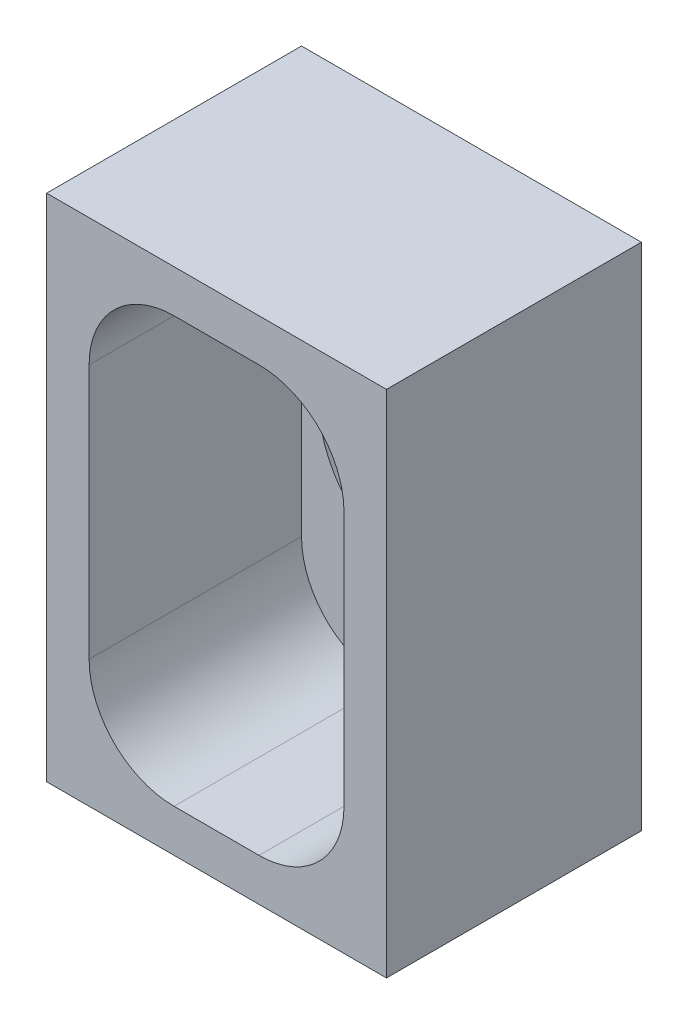
ISO-10303-21;
HEADER;
FILE_DESCRIPTION(('STEP AP214'),'2;1');
FILE_NAME('part.step','',(''),(''),'','','');
FILE_SCHEMA(('AUTOMOTIVE_DESIGN { 1 0 10303 214 1 1 1 1 }'));
ENDSEC;
DATA;
#1=APPLICATION_CONTEXT('core data for automotive mechanical design processes');
#2=APPLICATION_PROTOCOL_DEFINITION('international standard','automotive_design',2000,#1);
#3=PRODUCT_CONTEXT('',#1,'mechanical');
#4=PRODUCT('Part','Part','',(#3));
#5=PRODUCT_RELATED_PRODUCT_CATEGORY('part','',(#4));
#6=PRODUCT_DEFINITION_FORMATION('','',#4);
#7=PRODUCT_DEFINITION_CONTEXT('part definition',#1,'design');
#8=PRODUCT_DEFINITION('design','',#6,#7);
#9=PRODUCT_DEFINITION_SHAPE('','',#8);
#10=(LENGTH_UNIT() NAMED_UNIT(*) SI_UNIT(.MILLI.,.METRE.));
#11=(NAMED_UNIT(*) PLANE_ANGLE_UNIT() SI_UNIT($,.RADIAN.));
#12=(NAMED_UNIT(*) SI_UNIT($,.STERADIAN.) SOLID_ANGLE_UNIT());
#13=UNCERTAINTY_MEASURE_WITH_UNIT(LENGTH_MEASURE(1.E-05),#10,'distance_accuracy_value','');
#14=(GEOMETRIC_REPRESENTATION_CONTEXT(3) GLOBAL_UNCERTAINTY_ASSIGNED_CONTEXT((#13)) GLOBAL_UNIT_ASSIGNED_CONTEXT((#10,
#11,#12)) REPRESENTATION_CONTEXT('',''));
#15=CARTESIAN_POINT('',(0.,0.,0.));
#16=DIRECTION('',(0.,0.,1.));
#17=DIRECTION('',(1.,0.,0.));
#18=AXIS2_PLACEMENT_3D('',#15,#16,#17);
#19=CARTESIAN_POINT('',(0.,8.5,5.));
#20=DIRECTION('',(0.,0.,-1.));
#21=DIRECTION('',(-1.,0.,0.));
#22=AXIS2_PLACEMENT_3D('',#19,#20,#21);
#23=CYLINDRICAL_SURFACE('',#22,1.6);
#24=CARTESIAN_POINT('',(0.,8.5,0.));
#25=DIRECTION('',(0.,0.,1.));
#26=DIRECTION('',(1.,0.,0.));
#27=AXIS2_PLACEMENT_3D('',#24,#25,#26);
#28=CIRCLE('',#27,1.6);
#29=CARTESIAN_POINT('',(1.6,8.5,0.));
#30=VERTEX_POINT('',#29);
#31=EDGE_CURVE('E199',#30,#30,#28,.T.);
#32=ORIENTED_EDGE('',*,*,#31,.F.);
#33=EDGE_LOOP('',(#32));
#34=FACE_BOUND('',#33,.T.);
#35=CARTESIAN_POINT('',(0.,8.5,2.5));
#36=DIRECTION('',(0.,0.,1.));
#37=DIRECTION('',(1.,0.,0.));
#38=AXIS2_PLACEMENT_3D('',#35,#36,#37);
#39=CIRCLE('',#38,1.6);
#40=CARTESIAN_POINT('',(1.6,8.5,2.5));
#41=VERTEX_POINT('',#40);
#42=EDGE_CURVE('E184',#41,#41,#39,.T.);
#43=ORIENTED_EDGE('',*,*,#42,.T.);
#44=EDGE_LOOP('',(#43));
#45=FACE_BOUND('',#44,.T.);
#46=ADVANCED_FACE('F33',(#34,#45),#23,.F.);
#47=CARTESIAN_POINT('',(0.,0.,5.));
#48=DIRECTION('',(0.,0.,-1.));
#49=DIRECTION('',(-1.,0.,0.));
#50=AXIS2_PLACEMENT_3D('',#47,#48,#49);
#51=CYLINDRICAL_SURFACE('',#50,3.25);
#52=CARTESIAN_POINT('',(0.,0.,0.));
#53=DIRECTION('',(0.,0.,1.));
#54=DIRECTION('',(1.,0.,0.));
#55=AXIS2_PLACEMENT_3D('',#52,#53,#54);
#56=CIRCLE('',#55,3.25);
#57=CARTESIAN_POINT('',(3.25,0.,0.));
#58=VERTEX_POINT('',#57);
#59=EDGE_CURVE('E196',#58,#58,#56,.T.);
#60=ORIENTED_EDGE('',*,*,#59,.F.);
#61=EDGE_LOOP('',(#60));
#62=FACE_BOUND('',#61,.T.);
#63=CARTESIAN_POINT('',(0.,0.,2.5));
#64=DIRECTION('',(0.,0.,1.));
#65=DIRECTION('',(1.,0.,0.));
#66=AXIS2_PLACEMENT_3D('',#63,#64,#65);
#67=CIRCLE('',#66,3.25);
#68=CARTESIAN_POINT('',(3.25,0.,2.5));
#69=VERTEX_POINT('',#68);
#70=EDGE_CURVE('E181',#69,#69,#67,.T.);
#71=ORIENTED_EDGE('',*,*,#70,.T.);
#72=EDGE_LOOP('',(#71));
#73=FACE_BOUND('',#72,.T.);
#74=ADVANCED_FACE('F294',(#62,#73),#51,.F.);
#75=CARTESIAN_POINT('',(8.5,0.,5.));
#76=DIRECTION('',(0.,0.,-1.));
#77=DIRECTION('',(-1.,0.,0.));
#78=AXIS2_PLACEMENT_3D('',#75,#76,#77);
#79=CYLINDRICAL_SURFACE('',#78,1.6);
#80=CARTESIAN_POINT('',(8.5,0.,0.));
#81=DIRECTION('',(0.,0.,1.));
#82=DIRECTION('',(1.,0.,0.));
#83=AXIS2_PLACEMENT_3D('',#80,#81,#82);
#84=CIRCLE('',#83,1.6);
#85=CARTESIAN_POINT('',(10.1,0.,0.));
#86=VERTEX_POINT('',#85);
#87=EDGE_CURVE('E193',#86,#86,#84,.T.);
#88=ORIENTED_EDGE('',*,*,#87,.F.);
#89=EDGE_LOOP('',(#88));
#90=FACE_BOUND('',#89,.T.);
#91=CARTESIAN_POINT('',(8.5,0.,2.5));
#92=DIRECTION('',(0.,0.,1.));
#93=DIRECTION('',(1.,0.,0.));
#94=AXIS2_PLACEMENT_3D('',#91,#92,#93);
#95=CIRCLE('',#94,1.6);
#96=CARTESIAN_POINT('',(10.1,0.,2.5));
#97=VERTEX_POINT('',#96);
#98=EDGE_CURVE('E178',#97,#97,#95,.T.);
#99=ORIENTED_EDGE('',*,*,#98,.T.);
#100=EDGE_LOOP('',(#99));
#101=FACE_BOUND('',#100,.T.);
#102=ADVANCED_FACE('F300',(#90,#101),#79,.F.);
#103=CARTESIAN_POINT('',(0.,-8.5,5.));
#104=DIRECTION('',(0.,0.,-1.));
#105=DIRECTION('',(-1.,0.,0.));
#106=AXIS2_PLACEMENT_3D('',#103,#104,#105);
#107=CYLINDRICAL_SURFACE('',#106,1.6);
#108=CARTESIAN_POINT('',(0.,-8.5,0.));
#109=DIRECTION('',(0.,0.,1.));
#110=DIRECTION('',(1.,0.,0.));
#111=AXIS2_PLACEMENT_3D('',#108,#109,#110);
#112=CIRCLE('',#111,1.6);
#113=CARTESIAN_POINT('',(1.6,-8.5,0.));
#114=VERTEX_POINT('',#113);
#115=EDGE_CURVE('E190',#114,#114,#112,.T.);
#116=ORIENTED_EDGE('',*,*,#115,.F.);
#117=EDGE_LOOP('',(#116));
#118=FACE_BOUND('',#117,.T.);
#119=CARTESIAN_POINT('',(0.,-8.5,2.5));
#120=DIRECTION('',(0.,0.,1.));
#121=DIRECTION('',(1.,0.,0.));
#122=AXIS2_PLACEMENT_3D('',#119,#120,#121);
#123=CIRCLE('',#122,1.6);
#124=CARTESIAN_POINT('',(1.6,-8.5,2.5));
#125=VERTEX_POINT('',#124);
#126=EDGE_CURVE('E175',#125,#125,#123,.T.);
#127=ORIENTED_EDGE('',*,*,#126,.T.);
#128=EDGE_LOOP('',(#127));
#129=FACE_BOUND('',#128,.T.);
#130=ADVANCED_FACE('F430',(#118,#129),#107,.F.);
#131=CARTESIAN_POINT('',(-8.5,0.,5.));
#132=DIRECTION('',(0.,0.,-1.));
#133=DIRECTION('',(-1.,0.,0.));
#134=AXIS2_PLACEMENT_3D('',#131,#132,#133);
#135=CYLINDRICAL_SURFACE('',#134,1.6);
#136=CARTESIAN_POINT('',(-8.5,0.,0.));
#137=DIRECTION('',(0.,0.,1.));
#138=DIRECTION('',(1.,0.,0.));
#139=AXIS2_PLACEMENT_3D('',#136,#137,#138);
#140=CIRCLE('',#139,1.6);
#141=CARTESIAN_POINT('',(-6.9,0.,0.));
#142=VERTEX_POINT('',#141);
#143=EDGE_CURVE('E187',#142,#142,#140,.T.);
#144=ORIENTED_EDGE('',*,*,#143,.F.);
#145=EDGE_LOOP('',(#144));
#146=FACE_BOUND('',#145,.T.);
#147=CARTESIAN_POINT('',(-8.5,0.,2.5));
#148=DIRECTION('',(0.,0.,1.));
#149=DIRECTION('',(1.,0.,0.));
#150=AXIS2_PLACEMENT_3D('',#147,#148,#149);
#151=CIRCLE('',#150,1.6);
#152=CARTESIAN_POINT('',(-6.9,0.,2.5));
#153=VERTEX_POINT('',#152);
#154=EDGE_CURVE('E172',#153,#153,#151,.T.);
#155=ORIENTED_EDGE('',*,*,#154,.T.);
#156=EDGE_LOOP('',(#155));
#157=FACE_BOUND('',#156,.T.);
#158=ADVANCED_FACE('F310',(#146,#157),#135,.F.);
#159=CARTESIAN_POINT('',(0.,0.,5.));
#160=DIRECTION('',(0.,0.,1.));
#161=DIRECTION('',(1.,0.,0.));
#162=AXIS2_PLACEMENT_3D('',#159,#160,#161);
#163=PLANE('',#162);
#164=DIRECTION('',(0.,1.,0.));
#165=VECTOR('',#164,1.);
#166=CARTESIAN_POINT('',(-15.,25.,5.));
#167=LINE('',#166,#165);
#168=CARTESIAN_POINT('',(-15.,-15.,5.));
#169=VERTEX_POINT('',#168);
#170=CARTESIAN_POINT('',(-15.,15.,5.));
#171=VERTEX_POINT('',#170);
#172=EDGE_CURVE('E267',#169,#171,#167,.T.);
#173=ORIENTED_EDGE('',*,*,#172,.F.);
#174=CARTESIAN_POINT('',(-5.00000000000001,-15.,5.));
#175=DIRECTION('',(0.,0.,1.));
#176=DIRECTION('',(1.,0.,0.));
#177=AXIS2_PLACEMENT_3D('',#174,#175,#176);
#178=CIRCLE('',#177,10.);
#179=CARTESIAN_POINT('',(-5.00000000000001,-25.,5.));
#180=VERTEX_POINT('',#179);
#181=EDGE_CURVE('E226',#169,#180,#178,.T.);
#182=ORIENTED_EDGE('',*,*,#181,.T.);
#183=DIRECTION('',(1.,0.,0.));
#184=VECTOR('',#183,1.);
#185=CARTESIAN_POINT('',(-20.,-25.,5.));
#186=LINE('',#185,#184);
#187=CARTESIAN_POINT('',(5.00000000000001,-25.,5.));
#188=VERTEX_POINT('',#187);
#189=EDGE_CURVE('E206',#180,#188,#186,.T.);
#190=ORIENTED_EDGE('',*,*,#189,.T.);
#191=CARTESIAN_POINT('',(5.00000000000001,-15.,5.));
#192=DIRECTION('',(0.,0.,1.));
#193=DIRECTION('',(1.,0.,0.));
#194=AXIS2_PLACEMENT_3D('',#191,#192,#193);
#195=CIRCLE('',#194,10.);
#196=CARTESIAN_POINT('',(15.,-15.,5.));
#197=VERTEX_POINT('',#196);
#198=EDGE_CURVE('E224',#188,#197,#195,.T.);
#199=ORIENTED_EDGE('',*,*,#198,.T.);
#200=DIRECTION('',(0.,1.,0.));
#201=VECTOR('',#200,1.);
#202=CARTESIAN_POINT('',(15.,25.,5.));
#203=LINE('',#202,#201);
#204=CARTESIAN_POINT('',(15.,15.,5.));
#205=VERTEX_POINT('',#204);
#206=EDGE_CURVE('E252',#197,#205,#203,.T.);
#207=ORIENTED_EDGE('',*,*,#206,.T.);
#208=CARTESIAN_POINT('',(5.,15.,5.));
#209=DIRECTION('',(0.,0.,1.));
#210=DIRECTION('',(1.,0.,0.));
#211=AXIS2_PLACEMENT_3D('',#208,#209,#210);
#212=CIRCLE('',#211,10.);
#213=CARTESIAN_POINT('',(5.,25.,5.));
#214=VERTEX_POINT('',#213);
#215=EDGE_CURVE('E222',#205,#214,#212,.T.);
#216=ORIENTED_EDGE('',*,*,#215,.T.);
#217=DIRECTION('',(-1.,0.,0.));
#218=VECTOR('',#217,1.);
#219=CARTESIAN_POINT('',(-20.,25.,5.));
#220=LINE('',#219,#218);
#221=CARTESIAN_POINT('',(-5.,25.,5.));
#222=VERTEX_POINT('',#221);
#223=EDGE_CURVE('E203',#214,#222,#220,.T.);
#224=ORIENTED_EDGE('',*,*,#223,.T.);
#225=CARTESIAN_POINT('',(-5.,15.,5.));
#226=DIRECTION('',(0.,0.,1.));
#227=DIRECTION('',(1.,0.,0.));
#228=AXIS2_PLACEMENT_3D('',#225,#226,#227);
#229=CIRCLE('',#228,10.);
#230=EDGE_CURVE('E220',#222,#171,#229,.T.);
#231=ORIENTED_EDGE('',*,*,#230,.T.);
#232=EDGE_LOOP('',(#173,#182,#190,#199,#207,#216,#224,#231));
#233=FACE_BOUND('',#232,.T.);
#234=CARTESIAN_POINT('',(0.,0.,5.));
#235=DIRECTION('',(0.,0.,1.));
#236=DIRECTION('',(1.,0.,0.));
#237=AXIS2_PLACEMENT_3D('',#234,#235,#236);
#238=CIRCLE('',#237,13.);
#239=CARTESIAN_POINT('',(13.,0.,5.));
#240=VERTEX_POINT('',#239);
#241=EDGE_CURVE('E166',#240,#240,#238,.T.);
#242=ORIENTED_EDGE('',*,*,#241,.F.);
#243=EDGE_LOOP('',(#242));
#244=FACE_BOUND('',#243,.T.);
#245=ADVANCED_FACE('F258',(#233,#244),#163,.T.);
#246=CARTESIAN_POINT('',(0.,0.,0.));
#247=DIRECTION('',(0.,0.,1.));
#248=DIRECTION('',(1.,0.,0.));
#249=AXIS2_PLACEMENT_3D('',#246,#247,#248);
#250=PLANE('',#249);
#251=DIRECTION('',(0.,1.,0.));
#252=VECTOR('',#251,1.);
#253=CARTESIAN_POINT('',(20.,25.,0.));
#254=LINE('',#253,#252);
#255=CARTESIAN_POINT('',(20.,-30.,0.));
#256=VERTEX_POINT('',#255);
#257=CARTESIAN_POINT('',(20.,30.,0.));
#258=VERTEX_POINT('',#257);
#259=EDGE_CURVE('E202',#256,#258,#254,.T.);
#260=ORIENTED_EDGE('',*,*,#259,.F.);
#261=DIRECTION('',(-1.,0.,0.));
#262=VECTOR('',#261,1.);
#263=CARTESIAN_POINT('',(20.,-30.,0.));
#264=LINE('',#263,#262);
#265=CARTESIAN_POINT('',(-20.,-30.,0.));
#266=VERTEX_POINT('',#265);
#267=EDGE_CURVE('E141',#256,#266,#264,.T.);
#268=ORIENTED_EDGE('',*,*,#267,.T.);
#269=DIRECTION('',(0.,-1.,0.));
#270=VECTOR('',#269,1.);
#271=CARTESIAN_POINT('',(-20.,25.,0.));
#272=LINE('',#271,#270);
#273=CARTESIAN_POINT('',(-20.,30.,0.));
#274=VERTEX_POINT('',#273);
#275=EDGE_CURVE('E207',#274,#266,#272,.T.);
#276=ORIENTED_EDGE('',*,*,#275,.F.);
#277=DIRECTION('',(1.,0.,0.));
#278=VECTOR('',#277,1.);
#279=CARTESIAN_POINT('',(20.,30.,0.));
#280=LINE('',#279,#278);
#281=EDGE_CURVE('E133',#274,#258,#280,.T.);
#282=ORIENTED_EDGE('',*,*,#281,.T.);
#283=EDGE_LOOP('',(#260,#268,#276,#282));
#284=FACE_BOUND('',#283,.T.);
#285=ORIENTED_EDGE('',*,*,#31,.T.);
#286=EDGE_LOOP('',(#285));
#287=FACE_BOUND('',#286,.T.);
#288=ORIENTED_EDGE('',*,*,#59,.T.);
#289=EDGE_LOOP('',(#288));
#290=FACE_BOUND('',#289,.T.);
#291=ORIENTED_EDGE('',*,*,#87,.T.);
#292=EDGE_LOOP('',(#291));
#293=FACE_BOUND('',#292,.T.);
#294=ORIENTED_EDGE('',*,*,#115,.T.);
#295=EDGE_LOOP('',(#294));
#296=FACE_BOUND('',#295,.T.);
#297=ORIENTED_EDGE('',*,*,#143,.T.);
#298=EDGE_LOOP('',(#297));
#299=FACE_BOUND('',#298,.T.);
#300=ADVANCED_FACE('F309',(#284,#287,#290,#293,#296,#299),#250,.F.);
#301=CARTESIAN_POINT('',(20.,25.,5.));
#302=DIRECTION('',(-1.,0.,0.));
#303=DIRECTION('',(0.,-1.,0.));
#304=AXIS2_PLACEMENT_3D('',#301,#302,#303);
#305=PLANE('',#304);
#306=ORIENTED_EDGE('',*,*,#259,.T.);
#307=DIRECTION('',(0.,0.,-1.));
#308=VECTOR('',#307,1.);
#309=CARTESIAN_POINT('',(20.,30.,30.));
#310=LINE('',#309,#308);
#311=CARTESIAN_POINT('',(20.,30.,30.));
#312=VERTEX_POINT('',#311);
#313=EDGE_CURVE('E127',#312,#258,#310,.T.);
#314=ORIENTED_EDGE('',*,*,#313,.F.);
#315=DIRECTION('',(0.,-1.,0.));
#316=VECTOR('',#315,1.);
#317=CARTESIAN_POINT('',(20.,25.,30.));
#318=LINE('',#317,#316);
#319=CARTESIAN_POINT('',(20.,-30.,30.));
#320=VERTEX_POINT('',#319);
#321=EDGE_CURVE('E121',#312,#320,#318,.T.);
#322=ORIENTED_EDGE('',*,*,#321,.T.);
#323=DIRECTION('',(0.,0.,-1.));
#324=VECTOR('',#323,1.);
#325=CARTESIAN_POINT('',(20.,-30.,30.));
#326=LINE('',#325,#324);
#327=EDGE_CURVE('E124',#320,#256,#326,.T.);
#328=ORIENTED_EDGE('',*,*,#327,.T.);
#329=EDGE_LOOP('',(#306,#314,#322,#328));
#330=FACE_BOUND('',#329,.T.);
#331=ADVANCED_FACE('F123',(#330),#305,.F.);
#332=CARTESIAN_POINT('',(-20.,25.,5.));
#333=DIRECTION('',(1.,0.,0.));
#334=DIRECTION('',(0.,1.,0.));
#335=AXIS2_PLACEMENT_3D('',#332,#333,#334);
#336=PLANE('',#335);
#337=ORIENTED_EDGE('',*,*,#275,.T.);
#338=DIRECTION('',(0.,0.,-1.));
#339=VECTOR('',#338,1.);
#340=CARTESIAN_POINT('',(-20.,-30.,30.));
#341=LINE('',#340,#339);
#342=CARTESIAN_POINT('',(-20.,-30.,30.));
#343=VERTEX_POINT('',#342);
#344=EDGE_CURVE('E142',#343,#266,#341,.T.);
#345=ORIENTED_EDGE('',*,*,#344,.F.);
#346=DIRECTION('',(0.,1.,0.));
#347=VECTOR('',#346,1.);
#348=CARTESIAN_POINT('',(-20.,25.,30.));
#349=LINE('',#348,#347);
#350=CARTESIAN_POINT('',(-20.,30.,30.));
#351=VERTEX_POINT('',#350);
#352=EDGE_CURVE('E147',#343,#351,#349,.T.);
#353=ORIENTED_EDGE('',*,*,#352,.T.);
#354=DIRECTION('',(0.,0.,-1.));
#355=VECTOR('',#354,1.);
#356=CARTESIAN_POINT('',(-20.,30.,30.));
#357=LINE('',#356,#355);
#358=EDGE_CURVE('E162',#351,#274,#357,.T.);
#359=ORIENTED_EDGE('',*,*,#358,.T.);
#360=EDGE_LOOP('',(#337,#345,#353,#359));
#361=FACE_BOUND('',#360,.T.);
#362=ADVANCED_FACE('F314',(#361),#336,.F.);
#363=CARTESIAN_POINT('',(0.,0.,2.5));
#364=DIRECTION('',(0.,0.,1.));
#365=DIRECTION('',(1.,0.,0.));
#366=AXIS2_PLACEMENT_3D('',#363,#364,#365);
#367=CYLINDRICAL_SURFACE('',#366,13.);
#368=CARTESIAN_POINT('',(0.,0.,2.5));
#369=DIRECTION('',(0.,0.,1.));
#370=DIRECTION('',(1.,0.,0.));
#371=AXIS2_PLACEMENT_3D('',#368,#369,#370);
#372=CIRCLE('',#371,13.);
#373=CARTESIAN_POINT('',(13.,0.,2.5));
#374=VERTEX_POINT('',#373);
#375=EDGE_CURVE('E169',#374,#374,#372,.T.);
#376=ORIENTED_EDGE('',*,*,#375,.F.);
#377=EDGE_LOOP('',(#376));
#378=FACE_BOUND('',#377,.T.);
#379=ORIENTED_EDGE('',*,*,#241,.T.);
#380=EDGE_LOOP('',(#379));
#381=FACE_BOUND('',#380,.T.);
#382=ADVANCED_FACE('F317',(#378,#381),#367,.F.);
#383=CARTESIAN_POINT('',(0.,0.,2.5));
#384=DIRECTION('',(0.,0.,1.));
#385=DIRECTION('',(1.,0.,0.));
#386=AXIS2_PLACEMENT_3D('',#383,#384,#385);
#387=PLANE('',#386);
#388=ORIENTED_EDGE('',*,*,#42,.F.);
#389=EDGE_LOOP('',(#388));
#390=FACE_BOUND('',#389,.T.);
#391=ORIENTED_EDGE('',*,*,#70,.F.);
#392=EDGE_LOOP('',(#391));
#393=FACE_BOUND('',#392,.T.);
#394=ORIENTED_EDGE('',*,*,#98,.F.);
#395=EDGE_LOOP('',(#394));
#396=FACE_BOUND('',#395,.T.);
#397=ORIENTED_EDGE('',*,*,#126,.F.);
#398=EDGE_LOOP('',(#397));
#399=FACE_BOUND('',#398,.T.);
#400=ORIENTED_EDGE('',*,*,#154,.F.);
#401=EDGE_LOOP('',(#400));
#402=FACE_BOUND('',#401,.T.);
#403=ORIENTED_EDGE('',*,*,#375,.T.);
#404=EDGE_LOOP('',(#403));
#405=FACE_BOUND('',#404,.T.);
#406=ADVANCED_FACE('F336',(#390,#393,#396,#399,#402,#405),#387,.T.);
#407=CARTESIAN_POINT('',(20.,25.,30.));
#408=DIRECTION('',(0.,-1.,0.));
#409=DIRECTION('',(0.,0.,-1.));
#410=AXIS2_PLACEMENT_3D('',#407,#408,#409);
#411=PLANE('',#410);
#412=ORIENTED_EDGE('',*,*,#223,.F.);
#413=DIRECTION('',(0.,0.,1.));
#414=VECTOR('',#413,1.);
#415=CARTESIAN_POINT('',(5.,25.,30.));
#416=LINE('',#415,#414);
#417=CARTESIAN_POINT('',(5.,25.,30.));
#418=VERTEX_POINT('',#417);
#419=EDGE_CURVE('E239',#214,#418,#416,.T.);
#420=ORIENTED_EDGE('',*,*,#419,.T.);
#421=DIRECTION('',(-1.,0.,0.));
#422=VECTOR('',#421,1.);
#423=CARTESIAN_POINT('',(20.,25.,30.));
#424=LINE('',#423,#422);
#425=CARTESIAN_POINT('',(-5.,25.,30.));
#426=VERTEX_POINT('',#425);
#427=EDGE_CURVE('E132',#418,#426,#424,.T.);
#428=ORIENTED_EDGE('',*,*,#427,.T.);
#429=DIRECTION('',(0.,0.,1.));
#430=VECTOR('',#429,1.);
#431=CARTESIAN_POINT('',(-5.,25.,5.));
#432=LINE('',#431,#430);
#433=EDGE_CURVE('E237',#426,#222,#432,.F.);
#434=ORIENTED_EDGE('',*,*,#433,.T.);
#435=EDGE_LOOP('',(#412,#420,#428,#434));
#436=FACE_BOUND('',#435,.T.);
#437=ADVANCED_FACE('F262',(#436),#411,.T.);
#438=CARTESIAN_POINT('',(20.,30.,30.));
#439=DIRECTION('',(0.,1.,0.));
#440=DIRECTION('',(0.,0.,1.));
#441=AXIS2_PLACEMENT_3D('',#438,#439,#440);
#442=PLANE('',#441);
#443=ORIENTED_EDGE('',*,*,#281,.F.);
#444=ORIENTED_EDGE('',*,*,#358,.F.);
#445=DIRECTION('',(1.,0.,0.));
#446=VECTOR('',#445,1.);
#447=CARTESIAN_POINT('',(20.,30.,30.));
#448=LINE('',#447,#446);
#449=EDGE_CURVE('E160',#351,#312,#448,.T.);
#450=ORIENTED_EDGE('',*,*,#449,.T.);
#451=ORIENTED_EDGE('',*,*,#313,.T.);
#452=EDGE_LOOP('',(#443,#444,#450,#451));
#453=FACE_BOUND('',#452,.T.);
#454=ADVANCED_FACE('F353',(#453),#442,.T.);
#455=CARTESIAN_POINT('',(0.,0.,30.));
#456=DIRECTION('',(0.,0.,1.));
#457=DIRECTION('',(1.,0.,0.));
#458=AXIS2_PLACEMENT_3D('',#455,#456,#457);
#459=PLANE('',#458);
#460=ORIENTED_EDGE('',*,*,#352,.F.);
#461=DIRECTION('',(-1.,0.,0.));
#462=VECTOR('',#461,1.);
#463=CARTESIAN_POINT('',(20.,-30.,30.));
#464=LINE('',#463,#462);
#465=EDGE_CURVE('E139',#320,#343,#464,.T.);
#466=ORIENTED_EDGE('',*,*,#465,.F.);
#467=ORIENTED_EDGE('',*,*,#321,.F.);
#468=ORIENTED_EDGE('',*,*,#449,.F.);
#469=EDGE_LOOP('',(#460,#466,#467,#468));
#470=FACE_BOUND('',#469,.T.);
#471=DIRECTION('',(0.,-1.,0.));
#472=VECTOR('',#471,1.);
#473=CARTESIAN_POINT('',(-15.,25.,30.));
#474=LINE('',#473,#472);
#475=CARTESIAN_POINT('',(-15.,15.,30.));
#476=VERTEX_POINT('',#475);
#477=CARTESIAN_POINT('',(-15.,-15.,30.));
#478=VERTEX_POINT('',#477);
#479=EDGE_CURVE('E272',#476,#478,#474,.T.);
#480=ORIENTED_EDGE('',*,*,#479,.F.);
#481=CARTESIAN_POINT('',(-5.,15.,30.));
#482=DIRECTION('',(0.,0.,1.));
#483=DIRECTION('',(1.,0.,0.));
#484=AXIS2_PLACEMENT_3D('',#481,#482,#483);
#485=CIRCLE('',#484,10.);
#486=EDGE_CURVE('E11',#476,#426,#485,.F.);
#487=ORIENTED_EDGE('',*,*,#486,.T.);
#488=ORIENTED_EDGE('',*,*,#427,.F.);
#489=CARTESIAN_POINT('',(5.,15.,30.));
#490=DIRECTION('',(0.,0.,1.));
#491=DIRECTION('',(1.,0.,0.));
#492=AXIS2_PLACEMENT_3D('',#489,#490,#491);
#493=CIRCLE('',#492,10.);
#494=CARTESIAN_POINT('',(15.,15.,30.));
#495=VERTEX_POINT('',#494);
#496=EDGE_CURVE('E41',#418,#495,#493,.F.);
#497=ORIENTED_EDGE('',*,*,#496,.T.);
#498=DIRECTION('',(0.,-1.,0.));
#499=VECTOR('',#498,1.);
#500=CARTESIAN_POINT('',(15.,25.,30.));
#501=LINE('',#500,#499);
#502=CARTESIAN_POINT('',(15.,-15.,30.));
#503=VERTEX_POINT('',#502);
#504=EDGE_CURVE('E152',#495,#503,#501,.T.);
#505=ORIENTED_EDGE('',*,*,#504,.T.);
#506=CARTESIAN_POINT('',(5.00000000000001,-15.,30.));
#507=DIRECTION('',(0.,0.,1.));
#508=DIRECTION('',(1.,0.,0.));
#509=AXIS2_PLACEMENT_3D('',#506,#507,#508);
#510=CIRCLE('',#509,10.);
#511=CARTESIAN_POINT('',(5.00000000000001,-25.,30.));
#512=VERTEX_POINT('',#511);
#513=EDGE_CURVE('E243',#503,#512,#510,.F.);
#514=ORIENTED_EDGE('',*,*,#513,.T.);
#515=DIRECTION('',(1.,0.,0.));
#516=VECTOR('',#515,1.);
#517=CARTESIAN_POINT('',(20.,-25.,30.));
#518=LINE('',#517,#516);
#519=CARTESIAN_POINT('',(-5.00000000000001,-25.,30.));
#520=VERTEX_POINT('',#519);
#521=EDGE_CURVE('E143',#520,#512,#518,.T.);
#522=ORIENTED_EDGE('',*,*,#521,.F.);
#523=CARTESIAN_POINT('',(-5.00000000000001,-15.,30.));
#524=DIRECTION('',(0.,0.,1.));
#525=DIRECTION('',(1.,0.,0.));
#526=AXIS2_PLACEMENT_3D('',#523,#524,#525);
#527=CIRCLE('',#526,10.);
#528=EDGE_CURVE('E241',#520,#478,#527,.F.);
#529=ORIENTED_EDGE('',*,*,#528,.T.);
#530=EDGE_LOOP('',(#480,#487,#488,#497,#505,#514,#522,#529));
#531=FACE_BOUND('',#530,.T.);
#532=ADVANCED_FACE('F145',(#470,#531),#459,.T.);
#533=CARTESIAN_POINT('',(20.,-25.,30.));
#534=DIRECTION('',(0.,1.,0.));
#535=DIRECTION('',(0.,0.,1.));
#536=AXIS2_PLACEMENT_3D('',#533,#534,#535);
#537=PLANE('',#536);
#538=ORIENTED_EDGE('',*,*,#189,.F.);
#539=DIRECTION('',(0.,0.,-1.));
#540=VECTOR('',#539,1.);
#541=CARTESIAN_POINT('',(-5.00000000000001,-25.,30.));
#542=LINE('',#541,#540);
#543=EDGE_CURVE('E231',#180,#520,#542,.F.);
#544=ORIENTED_EDGE('',*,*,#543,.T.);
#545=ORIENTED_EDGE('',*,*,#521,.T.);
#546=DIRECTION('',(0.,0.,-1.));
#547=VECTOR('',#546,1.);
#548=CARTESIAN_POINT('',(5.00000000000001,-25.,5.));
#549=LINE('',#548,#547);
#550=EDGE_CURVE('E228',#512,#188,#549,.T.);
#551=ORIENTED_EDGE('',*,*,#550,.T.);
#552=EDGE_LOOP('',(#538,#544,#545,#551));
#553=FACE_BOUND('',#552,.T.);
#554=ADVANCED_FACE('F281',(#553),#537,.T.);
#555=CARTESIAN_POINT('',(20.,-30.,30.));
#556=DIRECTION('',(0.,-1.,0.));
#557=DIRECTION('',(0.,0.,-1.));
#558=AXIS2_PLACEMENT_3D('',#555,#556,#557);
#559=PLANE('',#558);
#560=ORIENTED_EDGE('',*,*,#267,.F.);
#561=ORIENTED_EDGE('',*,*,#327,.F.);
#562=ORIENTED_EDGE('',*,*,#465,.T.);
#563=ORIENTED_EDGE('',*,*,#344,.T.);
#564=EDGE_LOOP('',(#560,#561,#562,#563));
#565=FACE_BOUND('',#564,.T.);
#566=ADVANCED_FACE('F137',(#565),#559,.T.);
#567=CARTESIAN_POINT('',(15.,0.,0.));
#568=DIRECTION('',(-1.,0.,0.));
#569=DIRECTION('',(0.,-1.,0.));
#570=AXIS2_PLACEMENT_3D('',#567,#568,#569);
#571=PLANE('',#570);
#572=ORIENTED_EDGE('',*,*,#206,.F.);
#573=DIRECTION('',(0.,0.,-1.));
#574=VECTOR('',#573,1.);
#575=CARTESIAN_POINT('',(15.,-15.,30.));
#576=LINE('',#575,#574);
#577=EDGE_CURVE('E235',#197,#503,#576,.F.);
#578=ORIENTED_EDGE('',*,*,#577,.T.);
#579=ORIENTED_EDGE('',*,*,#504,.F.);
#580=DIRECTION('',(0.,0.,1.));
#581=VECTOR('',#580,1.);
#582=CARTESIAN_POINT('',(15.,15.,5.));
#583=LINE('',#582,#581);
#584=EDGE_CURVE('E233',#495,#205,#583,.F.);
#585=ORIENTED_EDGE('',*,*,#584,.T.);
#586=EDGE_LOOP('',(#572,#578,#579,#585));
#587=FACE_BOUND('',#586,.T.);
#588=ADVANCED_FACE('F249',(#587),#571,.T.);
#589=CARTESIAN_POINT('',(-15.,0.,0.));
#590=DIRECTION('',(1.,0.,0.));
#591=DIRECTION('',(0.,-1.,0.));
#592=AXIS2_PLACEMENT_3D('',#589,#590,#591);
#593=PLANE('',#592);
#594=ORIENTED_EDGE('',*,*,#479,.T.);
#595=DIRECTION('',(0.,0.,-1.));
#596=VECTOR('',#595,1.);
#597=CARTESIAN_POINT('',(-15.,-15.,5.));
#598=LINE('',#597,#596);
#599=EDGE_CURVE('E217',#478,#169,#598,.T.);
#600=ORIENTED_EDGE('',*,*,#599,.T.);
#601=ORIENTED_EDGE('',*,*,#172,.T.);
#602=DIRECTION('',(0.,0.,1.));
#603=VECTOR('',#602,1.);
#604=CARTESIAN_POINT('',(-15.,15.,30.));
#605=LINE('',#604,#603);
#606=EDGE_CURVE('E210',#171,#476,#605,.T.);
#607=ORIENTED_EDGE('',*,*,#606,.T.);
#608=EDGE_LOOP('',(#594,#600,#601,#607));
#609=FACE_BOUND('',#608,.T.);
#610=ADVANCED_FACE('F270',(#609),#593,.T.);
#611=CARTESIAN_POINT('',(-5.00000000000001,-15.,0.));
#612=DIRECTION('',(0.,0.,1.));
#613=DIRECTION('',(1.,0.,0.));
#614=AXIS2_PLACEMENT_3D('',#611,#612,#613);
#615=CYLINDRICAL_SURFACE('',#614,10.);
#616=ORIENTED_EDGE('',*,*,#528,.F.);
#617=ORIENTED_EDGE('',*,*,#543,.F.);
#618=ORIENTED_EDGE('',*,*,#181,.F.);
#619=ORIENTED_EDGE('',*,*,#599,.F.);
#620=EDGE_LOOP('',(#616,#617,#618,#619));
#621=FACE_BOUND('',#620,.T.);
#622=ADVANCED_FACE('F277',(#621),#615,.F.);
#623=CARTESIAN_POINT('',(5.00000000000001,-15.,30.));
#624=DIRECTION('',(0.,0.,1.));
#625=DIRECTION('',(1.,0.,0.));
#626=AXIS2_PLACEMENT_3D('',#623,#624,#625);
#627=CYLINDRICAL_SURFACE('',#626,10.);
#628=ORIENTED_EDGE('',*,*,#513,.F.);
#629=ORIENTED_EDGE('',*,*,#577,.F.);
#630=ORIENTED_EDGE('',*,*,#198,.F.);
#631=ORIENTED_EDGE('',*,*,#550,.F.);
#632=EDGE_LOOP('',(#628,#629,#630,#631));
#633=FACE_BOUND('',#632,.T.);
#634=ADVANCED_FACE('F285',(#633),#627,.F.);
#635=CARTESIAN_POINT('',(5.,15.,30.));
#636=DIRECTION('',(0.,0.,-1.));
#637=DIRECTION('',(-1.,0.,0.));
#638=AXIS2_PLACEMENT_3D('',#635,#636,#637);
#639=CYLINDRICAL_SURFACE('',#638,10.);
#640=ORIENTED_EDGE('',*,*,#215,.F.);
#641=ORIENTED_EDGE('',*,*,#584,.F.);
#642=ORIENTED_EDGE('',*,*,#496,.F.);
#643=ORIENTED_EDGE('',*,*,#419,.F.);
#644=EDGE_LOOP('',(#640,#641,#642,#643));
#645=FACE_BOUND('',#644,.T.);
#646=ADVANCED_FACE('F254',(#645),#639,.F.);
#647=CARTESIAN_POINT('',(-5.,15.,0.));
#648=DIRECTION('',(0.,0.,-1.));
#649=DIRECTION('',(-1.,0.,0.));
#650=AXIS2_PLACEMENT_3D('',#647,#648,#649);
#651=CYLINDRICAL_SURFACE('',#650,10.);
#652=ORIENTED_EDGE('',*,*,#230,.F.);
#653=ORIENTED_EDGE('',*,*,#433,.F.);
#654=ORIENTED_EDGE('',*,*,#486,.F.);
#655=ORIENTED_EDGE('',*,*,#606,.F.);
#656=EDGE_LOOP('',(#652,#653,#654,#655));
#657=FACE_BOUND('',#656,.T.);
#658=ADVANCED_FACE('F35',(#657),#651,.F.);
#659=CLOSED_SHELL('',(#46,#74,#102,#130,#158,#245,#300,#331,#362,#382,#406,#437,#454,#532,#554,
#566,#588,#610,#622,#634,#646,#658));
#660=MANIFOLD_SOLID_BREP('B2',#659);
#661=ADVANCED_BREP_SHAPE_REPRESENTATION('',(#18,#660),#14);
#662=SHAPE_DEFINITION_REPRESENTATION(#9,#661);
ENDSEC;
END-ISO-10303-21;
